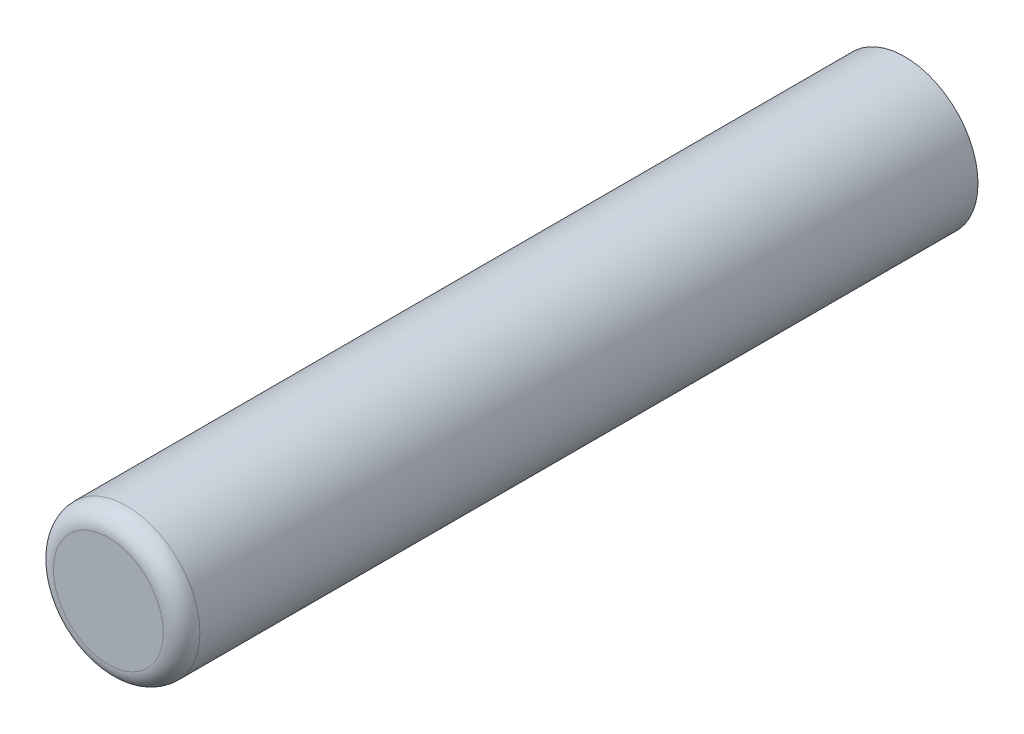
ISO-10303-21;
HEADER;
FILE_DESCRIPTION(('STEP AP214'),'2;1');
FILE_NAME('part.step','',(''),(''),'','','');
FILE_SCHEMA(('AUTOMOTIVE_DESIGN { 1 0 10303 214 1 1 1 1 }'));
ENDSEC;
DATA;
#1=APPLICATION_CONTEXT('core data for automotive mechanical design processes');
#2=APPLICATION_PROTOCOL_DEFINITION('international standard','automotive_design',2000,#1);
#3=PRODUCT_CONTEXT('',#1,'mechanical');
#4=PRODUCT('Part','Part','',(#3));
#5=PRODUCT_RELATED_PRODUCT_CATEGORY('part','',(#4));
#6=PRODUCT_DEFINITION_FORMATION('','',#4);
#7=PRODUCT_DEFINITION_CONTEXT('part definition',#1,'design');
#8=PRODUCT_DEFINITION('design','',#6,#7);
#9=PRODUCT_DEFINITION_SHAPE('','',#8);
#10=(LENGTH_UNIT() NAMED_UNIT(*) SI_UNIT(.MILLI.,.METRE.));
#11=(NAMED_UNIT(*) PLANE_ANGLE_UNIT() SI_UNIT($,.RADIAN.));
#12=(NAMED_UNIT(*) SI_UNIT($,.STERADIAN.) SOLID_ANGLE_UNIT());
#13=UNCERTAINTY_MEASURE_WITH_UNIT(LENGTH_MEASURE(1.E-05),#10,'distance_accuracy_value','');
#14=(GEOMETRIC_REPRESENTATION_CONTEXT(3) GLOBAL_UNCERTAINTY_ASSIGNED_CONTEXT((#13)) GLOBAL_UNIT_ASSIGNED_CONTEXT((#10,
#11,#12)) REPRESENTATION_CONTEXT('',''));
#15=CARTESIAN_POINT('',(0.,0.,0.));
#16=DIRECTION('',(0.,0.,1.));
#17=DIRECTION('',(1.,0.,0.));
#18=AXIS2_PLACEMENT_3D('',#15,#16,#17);
#19=CARTESIAN_POINT('',(0.,0.,87.));
#20=DIRECTION('',(0.,0.,-1.));
#21=DIRECTION('',(-1.,0.,0.));
#22=AXIS2_PLACEMENT_3D('',#19,#20,#21);
#23=CYLINDRICAL_SURFACE('',#22,8.);
#24=CARTESIAN_POINT('',(0.,0.,85.));
#25=DIRECTION('',(0.,0.,1.));
#26=DIRECTION('',(1.,0.,0.));
#27=AXIS2_PLACEMENT_3D('',#24,#25,#26);
#28=CIRCLE('',#27,8.);
#29=CARTESIAN_POINT('',(8.,0.,85.));
#30=VERTEX_POINT('',#29);
#31=EDGE_CURVE('E10',#30,#30,#28,.F.);
#32=ORIENTED_EDGE('',*,*,#31,.T.);
#33=EDGE_LOOP('',(#32));
#34=FACE_BOUND('',#33,.T.);
#35=CARTESIAN_POINT('',(0.,0.,0.));
#36=DIRECTION('',(0.,0.,1.));
#37=DIRECTION('',(1.,0.,0.));
#38=AXIS2_PLACEMENT_3D('',#35,#36,#37);
#39=CIRCLE('',#38,8.);
#40=CARTESIAN_POINT('',(8.,0.,0.));
#41=VERTEX_POINT('',#40);
#42=EDGE_CURVE('E41',#41,#41,#39,.T.);
#43=ORIENTED_EDGE('',*,*,#42,.T.);
#44=EDGE_LOOP('',(#43));
#45=FACE_BOUND('',#44,.T.);
#46=ADVANCED_FACE('F30',(#34,#45),#23,.T.);
#47=CARTESIAN_POINT('',(0.,0.,87.));
#48=DIRECTION('',(0.,0.,1.));
#49=DIRECTION('',(1.,0.,0.));
#50=AXIS2_PLACEMENT_3D('',#47,#48,#49);
#51=PLANE('',#50);
#52=CARTESIAN_POINT('',(0.,0.,87.));
#53=DIRECTION('',(0.,0.,1.));
#54=DIRECTION('',(1.,0.,0.));
#55=AXIS2_PLACEMENT_3D('',#52,#53,#54);
#56=CIRCLE('',#55,6.);
#57=CARTESIAN_POINT('',(6.,0.,87.));
#58=VERTEX_POINT('',#57);
#59=EDGE_CURVE('E37',#58,#58,#56,.T.);
#60=ORIENTED_EDGE('',*,*,#59,.T.);
#61=EDGE_LOOP('',(#60));
#62=FACE_BOUND('',#61,.T.);
#63=ADVANCED_FACE('F65',(#62),#51,.T.);
#64=CARTESIAN_POINT('',(0.,0.,0.));
#65=DIRECTION('',(0.,0.,1.));
#66=DIRECTION('',(1.,0.,0.));
#67=AXIS2_PLACEMENT_3D('',#64,#65,#66);
#68=PLANE('',#67);
#69=CARTESIAN_POINT('',(0.,0.,0.));
#70=DIRECTION('',(0.,0.,-1.));
#71=DIRECTION('',(-1.,0.,0.));
#72=AXIS2_PLACEMENT_3D('',#69,#70,#71);
#73=CIRCLE('',#72,5.);
#74=CARTESIAN_POINT('',(-5.,0.,0.));
#75=VERTEX_POINT('',#74);
#76=EDGE_CURVE('E48',#75,#75,#73,.T.);
#77=ORIENTED_EDGE('',*,*,#76,.F.);
#78=EDGE_LOOP('',(#77));
#79=FACE_BOUND('',#78,.T.);
#80=ORIENTED_EDGE('',*,*,#42,.F.);
#81=EDGE_LOOP('',(#80));
#82=FACE_BOUND('',#81,.T.);
#83=ADVANCED_FACE('F62',(#79,#82),#68,.F.);
#84=CARTESIAN_POINT('',(0.,0.,85.));
#85=DIRECTION('',(0.,0.,1.));
#86=DIRECTION('',(1.,0.,0.));
#87=AXIS2_PLACEMENT_3D('',#84,#85,#86);
#88=TOROIDAL_SURFACE('',#87,6.,2.);
#89=ORIENTED_EDGE('',*,*,#31,.F.);
#90=EDGE_LOOP('',(#89));
#91=FACE_BOUND('',#90,.T.);
#92=ORIENTED_EDGE('',*,*,#59,.F.);
#93=EDGE_LOOP('',(#92));
#94=FACE_BOUND('',#93,.T.);
#95=ADVANCED_FACE('F32',(#91,#94),#88,.T.);
#96=CARTESIAN_POINT('',(0.,0.,25.));
#97=DIRECTION('',(0.,0.,-1.));
#98=DIRECTION('',(-1.,0.,0.));
#99=AXIS2_PLACEMENT_3D('',#96,#97,#98);
#100=CYLINDRICAL_SURFACE('',#99,5.);
#101=CARTESIAN_POINT('',(0.,0.,25.));
#102=DIRECTION('',(0.,0.,-1.));
#103=DIRECTION('',(-1.,0.,0.));
#104=AXIS2_PLACEMENT_3D('',#101,#102,#103);
#105=CIRCLE('',#104,5.);
#106=CARTESIAN_POINT('',(-5.,0.,25.));
#107=VERTEX_POINT('',#106);
#108=EDGE_CURVE('E45',#107,#107,#105,.T.);
#109=ORIENTED_EDGE('',*,*,#108,.F.);
#110=EDGE_LOOP('',(#109));
#111=FACE_BOUND('',#110,.T.);
#112=ORIENTED_EDGE('',*,*,#76,.T.);
#113=EDGE_LOOP('',(#112));
#114=FACE_BOUND('',#113,.T.);
#115=ADVANCED_FACE('F56',(#111,#114),#100,.F.);
#116=CARTESIAN_POINT('',(0.,0.,25.));
#117=DIRECTION('',(0.,0.,-1.));
#118=DIRECTION('',(-1.,0.,0.));
#119=AXIS2_PLACEMENT_3D('',#116,#117,#118);
#120=PLANE('',#119);
#121=ORIENTED_EDGE('',*,*,#108,.T.);
#122=EDGE_LOOP('',(#121));
#123=FACE_BOUND('',#122,.T.);
#124=ADVANCED_FACE('F54',(#123),#120,.T.);
#125=CLOSED_SHELL('',(#46,#63,#83,#95,#115,#124));
#126=MANIFOLD_SOLID_BREP('B2',#125);
#127=ADVANCED_BREP_SHAPE_REPRESENTATION('',(#18,#126),#14);
#128=SHAPE_DEFINITION_REPRESENTATION(#9,#127);
ENDSEC;
END-ISO-10303-21;
